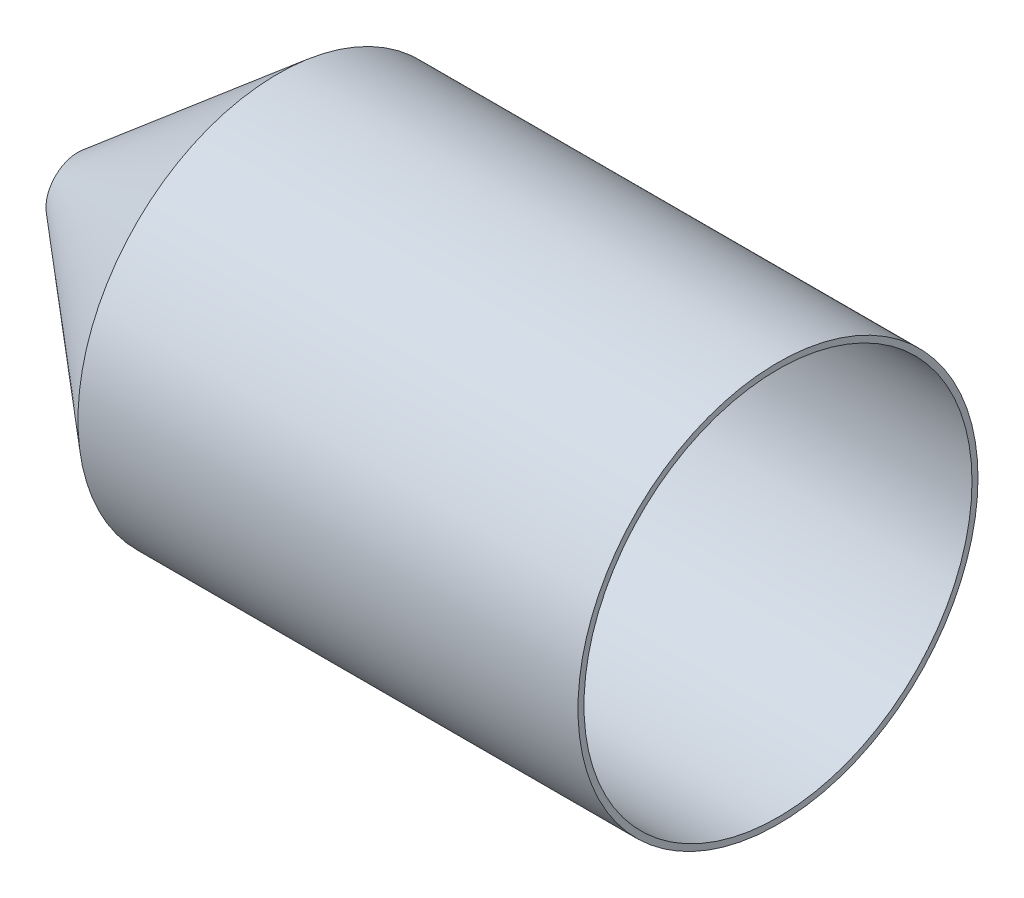
ISO-10303-21;
HEADER;
FILE_DESCRIPTION(('STEP AP214'),'2;1');
FILE_NAME('part.step','',(''),(''),'','','');
FILE_SCHEMA(('AUTOMOTIVE_DESIGN { 1 0 10303 214 1 1 1 1 }'));
ENDSEC;
DATA;
#1=APPLICATION_CONTEXT('core data for automotive mechanical design processes');
#2=APPLICATION_PROTOCOL_DEFINITION('international standard','automotive_design',2000,#1);
#3=PRODUCT_CONTEXT('',#1,'mechanical');
#4=PRODUCT('Part','Part','',(#3));
#5=PRODUCT_RELATED_PRODUCT_CATEGORY('part','',(#4));
#6=PRODUCT_DEFINITION_FORMATION('','',#4);
#7=PRODUCT_DEFINITION_CONTEXT('part definition',#1,'design');
#8=PRODUCT_DEFINITION('design','',#6,#7);
#9=PRODUCT_DEFINITION_SHAPE('','',#8);
#10=(LENGTH_UNIT() NAMED_UNIT(*) SI_UNIT(.MILLI.,.METRE.));
#11=(NAMED_UNIT(*) PLANE_ANGLE_UNIT() SI_UNIT($,.RADIAN.));
#12=(NAMED_UNIT(*) SI_UNIT($,.STERADIAN.) SOLID_ANGLE_UNIT());
#13=UNCERTAINTY_MEASURE_WITH_UNIT(LENGTH_MEASURE(1.E-05),#10,'distance_accuracy_value','');
#14=(GEOMETRIC_REPRESENTATION_CONTEXT(3) GLOBAL_UNCERTAINTY_ASSIGNED_CONTEXT((#13)) GLOBAL_UNIT_ASSIGNED_CONTEXT((#10,
#11,#12)) REPRESENTATION_CONTEXT('',''));
#15=CARTESIAN_POINT('',(0.,0.,0.));
#16=DIRECTION('',(0.,0.,1.));
#17=DIRECTION('',(1.,0.,0.));
#18=AXIS2_PLACEMENT_3D('',#15,#16,#17);
#19=CARTESIAN_POINT('',(-100.,0.,0.));
#20=DIRECTION('',(1.,0.,0.));
#21=DIRECTION('',(0.,0.,-1.));
#22=AXIS2_PLACEMENT_3D('',#19,#20,#21);
#23=CONICAL_SURFACE('',#22,16.,0.698659824721463);
#24=CARTESIAN_POINT('',(0.,0.,0.));
#25=DIRECTION('',(-1.,0.,0.));
#26=DIRECTION('',(0.,0.,1.));
#27=AXIS2_PLACEMENT_3D('',#24,#25,#26);
#28=CIRCLE('',#27,100.);
#29=CARTESIAN_POINT('',(0.,0.,-100.));
#30=VERTEX_POINT('',#29);
#31=EDGE_CURVE('E44',#30,#30,#28,.T.);
#32=CARTESIAN_POINT('',(-100.,0.,0.));
#33=DIRECTION('',(1.,0.,0.));
#34=DIRECTION('',(0.,0.,-1.));
#35=AXIS2_PLACEMENT_3D('',#32,#33,#34);
#36=CIRCLE('',#35,16.);
#37=CARTESIAN_POINT('',(-100.,0.,-16.));
#38=VERTEX_POINT('',#37);
#39=EDGE_CURVE('E11',#38,#38,#36,.T.);
#40=CARTESIAN_POINT('',(0.,0.,-100.));
#41=CARTESIAN_POINT('',(-1.04166666666667,0.,-99.125));
#42=CARTESIAN_POINT('',(-2.08333333333334,0.,-98.25));
#43=CARTESIAN_POINT('',(-4.16666666666667,0.,-96.5));
#44=CARTESIAN_POINT('',(-5.20833333333334,0.,-95.625));
#45=CARTESIAN_POINT('',(-7.29166666666667,0.,-93.875));
#46=CARTESIAN_POINT('',(-8.33333333333333,0.,-93.));
#47=CARTESIAN_POINT('',(-10.4166666666667,0.,-91.25));
#48=CARTESIAN_POINT('',(-11.4583333333333,0.,-90.375));
#49=CARTESIAN_POINT('',(-13.5416666666667,0.,-88.625));
#50=CARTESIAN_POINT('',(-14.5833333333333,0.,-87.75));
#51=CARTESIAN_POINT('',(-16.6666666666667,0.,-86.));
#52=CARTESIAN_POINT('',(-17.7083333333333,0.,-85.125));
#53=CARTESIAN_POINT('',(-19.7916666666667,0.,-83.375));
#54=CARTESIAN_POINT('',(-20.8333333333333,0.,-82.5));
#55=CARTESIAN_POINT('',(-22.9166666666667,0.,-80.75));
#56=CARTESIAN_POINT('',(-23.9583333333333,0.,-79.875));
#57=CARTESIAN_POINT('',(-26.0416666666667,0.,-78.125));
#58=CARTESIAN_POINT('',(-27.0833333333333,0.,-77.25));
#59=CARTESIAN_POINT('',(-29.1666666666667,0.,-75.5));
#60=CARTESIAN_POINT('',(-30.2083333333333,0.,-74.625));
#61=CARTESIAN_POINT('',(-32.2916666666667,0.,-72.875));
#62=CARTESIAN_POINT('',(-33.3333333333333,0.,-72.));
#63=CARTESIAN_POINT('',(-35.4166666666667,0.,-70.25));
#64=CARTESIAN_POINT('',(-36.4583333333333,0.,-69.375));
#65=CARTESIAN_POINT('',(-38.5416666666667,0.,-67.625));
#66=CARTESIAN_POINT('',(-39.5833333333333,0.,-66.75));
#67=CARTESIAN_POINT('',(-41.6666666666667,0.,-65.));
#68=CARTESIAN_POINT('',(-42.7083333333333,0.,-64.125));
#69=CARTESIAN_POINT('',(-44.7916666666667,0.,-62.375));
#70=CARTESIAN_POINT('',(-45.8333333333333,0.,-61.5));
#71=CARTESIAN_POINT('',(-47.9166666666667,0.,-59.75));
#72=CARTESIAN_POINT('',(-48.9583333333333,0.,-58.875));
#73=CARTESIAN_POINT('',(-51.0416666666667,0.,-57.125));
#74=CARTESIAN_POINT('',(-52.0833333333333,0.,-56.25));
#75=CARTESIAN_POINT('',(-54.1666666666667,0.,-54.5));
#76=CARTESIAN_POINT('',(-55.2083333333333,0.,-53.625));
#77=CARTESIAN_POINT('',(-57.2916666666667,0.,-51.875));
#78=CARTESIAN_POINT('',(-58.3333333333333,0.,-51.));
#79=CARTESIAN_POINT('',(-60.4166666666667,0.,-49.25));
#80=CARTESIAN_POINT('',(-61.4583333333333,0.,-48.375));
#81=CARTESIAN_POINT('',(-63.5416666666667,0.,-46.625));
#82=CARTESIAN_POINT('',(-64.5833333333333,0.,-45.75));
#83=CARTESIAN_POINT('',(-66.6666666666667,0.,-44.));
#84=CARTESIAN_POINT('',(-67.7083333333333,0.,-43.125));
#85=CARTESIAN_POINT('',(-69.7916666666667,0.,-41.375));
#86=CARTESIAN_POINT('',(-70.8333333333333,0.,-40.5));
#87=CARTESIAN_POINT('',(-72.9166666666667,0.,-38.75));
#88=CARTESIAN_POINT('',(-73.9583333333333,0.,-37.875));
#89=CARTESIAN_POINT('',(-76.0416666666667,0.,-36.125));
#90=CARTESIAN_POINT('',(-77.0833333333333,0.,-35.25));
#91=CARTESIAN_POINT('',(-79.1666666666667,0.,-33.5));
#92=CARTESIAN_POINT('',(-80.2083333333333,0.,-32.625));
#93=CARTESIAN_POINT('',(-82.2916666666667,0.,-30.875));
#94=CARTESIAN_POINT('',(-83.3333333333333,0.,-30.));
#95=CARTESIAN_POINT('',(-85.4166666666667,0.,-28.25));
#96=CARTESIAN_POINT('',(-86.4583333333333,0.,-27.375));
#97=CARTESIAN_POINT('',(-88.5416666666667,0.,-25.625));
#98=CARTESIAN_POINT('',(-89.5833333333333,0.,-24.75));
#99=CARTESIAN_POINT('',(-91.6666666666667,0.,-23.));
#100=CARTESIAN_POINT('',(-92.7083333333333,0.,-22.125));
#101=CARTESIAN_POINT('',(-94.7916666666667,0.,-20.375));
#102=CARTESIAN_POINT('',(-95.8333333333333,0.,-19.5));
#103=CARTESIAN_POINT('',(-97.9166666666667,0.,-17.75));
#104=CARTESIAN_POINT('',(-98.9583333333333,0.,-16.875));
#105=CARTESIAN_POINT('',(-100.,0.,-16.));
#106=B_SPLINE_CURVE_WITH_KNOTS('',3,(#40,#41,#42,#43,#44,#45,#46,#47,#48,#49,#50,#51,#52,#53,
#54,#55,#56,#57,#58,#59,#60,#61,#62,#63,#64,#65,#66,#67,#68,#69,#70,#71,#72,#73,#74,#75,#76,#77,
#78,#79,#80,#81,#82,#83,#84,#85,#86,#87,#88,#89,#90,#91,#92,#93,#94,#95,#96,#97,#98,#99,#100,
#101,#102,#103,#104,#105),.UNSPECIFIED.,.F.,.F.,(4,2,2,2,2,2,2,2,2,2,2,2,2,2,2,2,2,2,2,2,2,2,2,
2,2,2,2,2,2,2,2,2,4),(0.,4.08120692932863,8.16241385865726,12.2436207879859,16.3248277173145,
20.4060346466431,24.4872415759718,28.5684485053004,32.649655434629,36.7308623639576,
40.8120692932863,44.8932762226149,48.9744831519435,53.0556900812722,57.1368970106008,
61.2181039399294,65.299310869258,69.3805177985867,73.4617247279153,77.5429316572439,
81.6241385865725,85.7053455159012,89.7865524452298,93.8677593745584,97.9489663038871,
102.030173233216,106.111380162544,110.192587091873,114.273794021202,118.35500095053,
122.436207879859,126.517414809187,130.598621738516),.UNSPECIFIED.);
#107=EDGE_CURVE('BSEAM40',#30,#38,#106,.T.);
#108=ORIENTED_EDGE('',*,*,#31,.T.);
#109=ORIENTED_EDGE('',*,*,#39,.T.);
#110=ORIENTED_EDGE('',*,*,#107,.T.);
#111=ORIENTED_EDGE('',*,*,#107,.F.);
#112=EDGE_LOOP('',(#108,#110,#109,#111));
#113=FACE_BOUND('',#112,.T.);
#114=ADVANCED_FACE('F40',(#113),#23,.T.);
#115=OPEN_SHELL('',(#114));
#116=SHELL_BASED_SURFACE_MODEL('B2',(#115));
#117=CARTESIAN_POINT('',(250.,0.,0.));
#118=DIRECTION('',(1.,0.,0.));
#119=DIRECTION('',(0.,0.,-1.));
#120=AXIS2_PLACEMENT_3D('',#117,#118,#119);
#121=PLANE('',#120);
#122=CARTESIAN_POINT('',(250.,0.,0.));
#123=DIRECTION('',(1.,0.,0.));
#124=DIRECTION('',(0.,0.,-1.));
#125=AXIS2_PLACEMENT_3D('',#122,#123,#124);
#126=CIRCLE('',#125,100.);
#127=CARTESIAN_POINT('',(250.,0.,-100.));
#128=VERTEX_POINT('',#127);
#129=EDGE_CURVE('E39',#128,#128,#126,.T.);
#130=ORIENTED_EDGE('',*,*,#129,.T.);
#131=EDGE_LOOP('',(#130));
#132=FACE_BOUND('',#131,.T.);
#133=CARTESIAN_POINT('',(250.,0.,0.));
#134=DIRECTION('',(1.,0.,0.));
#135=DIRECTION('',(0.,0.,-1.));
#136=AXIS2_PLACEMENT_3D('',#133,#134,#135);
#137=CIRCLE('',#136,97.);
#138=CARTESIAN_POINT('',(250.,0.,-97.));
#139=VERTEX_POINT('',#138);
#140=EDGE_CURVE('E75',#139,#139,#137,.T.);
#141=ORIENTED_EDGE('',*,*,#140,.F.);
#142=EDGE_LOOP('',(#141));
#143=FACE_BOUND('',#142,.T.);
#144=ADVANCED_FACE('F64',(#132,#143),#121,.T.);
#145=CARTESIAN_POINT('',(0.,0.,0.));
#146=DIRECTION('',(1.,0.,0.));
#147=DIRECTION('',(0.,0.,-1.));
#148=AXIS2_PLACEMENT_3D('',#145,#146,#147);
#149=PLANE('',#148);
#150=CARTESIAN_POINT('',(0.,0.,0.));
#151=DIRECTION('',(1.,0.,0.));
#152=DIRECTION('',(0.,0.,-1.));
#153=AXIS2_PLACEMENT_3D('',#150,#151,#152);
#154=CIRCLE('',#153,100.);
#155=CARTESIAN_POINT('',(0.,0.,-100.));
#156=VERTEX_POINT('',#155);
#157=EDGE_CURVE('E68',#156,#156,#154,.T.);
#158=ORIENTED_EDGE('',*,*,#157,.F.);
#159=EDGE_LOOP('',(#158));
#160=FACE_BOUND('',#159,.T.);
#161=CARTESIAN_POINT('',(0.,0.,0.));
#162=DIRECTION('',(1.,0.,0.));
#163=DIRECTION('',(0.,0.,-1.));
#164=AXIS2_PLACEMENT_3D('',#161,#162,#163);
#165=CIRCLE('',#164,97.);
#166=CARTESIAN_POINT('',(0.,0.,-97.));
#167=VERTEX_POINT('',#166);
#168=EDGE_CURVE('E77',#167,#167,#165,.T.);
#169=ORIENTED_EDGE('',*,*,#168,.T.);
#170=EDGE_LOOP('',(#169));
#171=FACE_BOUND('',#170,.T.);
#172=ADVANCED_FACE('F87',(#160,#171),#149,.F.);
#173=CARTESIAN_POINT('',(250.,0.,0.));
#174=DIRECTION('',(-1.,0.,0.));
#175=DIRECTION('',(0.,0.,1.));
#176=AXIS2_PLACEMENT_3D('',#173,#174,#175);
#177=CYLINDRICAL_SURFACE('',#176,100.);
#178=ORIENTED_EDGE('',*,*,#129,.F.);
#179=EDGE_LOOP('',(#178));
#180=FACE_BOUND('',#179,.T.);
#181=ORIENTED_EDGE('',*,*,#157,.T.);
#182=EDGE_LOOP('',(#181));
#183=FACE_BOUND('',#182,.T.);
#184=ADVANCED_FACE('F66',(#180,#183),#177,.T.);
#185=CARTESIAN_POINT('',(250.,0.,0.));
#186=DIRECTION('',(-1.,0.,0.));
#187=DIRECTION('',(0.,0.,1.));
#188=AXIS2_PLACEMENT_3D('',#185,#186,#187);
#189=CYLINDRICAL_SURFACE('',#188,97.);
#190=ORIENTED_EDGE('',*,*,#140,.T.);
#191=EDGE_LOOP('',(#190));
#192=FACE_BOUND('',#191,.T.);
#193=ORIENTED_EDGE('',*,*,#168,.F.);
#194=EDGE_LOOP('',(#193));
#195=FACE_BOUND('',#194,.T.);
#196=ADVANCED_FACE('F83',(#192,#195),#189,.F.);
#197=CLOSED_SHELL('',(#144,#172,#184,#196));
#198=MANIFOLD_SOLID_BREP('B6',#197);
#199=ADVANCED_BREP_SHAPE_REPRESENTATION('',(#18,#198),#14);
#200=MANIFOLD_SURFACE_SHAPE_REPRESENTATION('',(#18,#116),#14);
#201=SHAPE_REPRESENTATION('',(#18),#14);
#202=SHAPE_DEFINITION_REPRESENTATION(#9,#201);
#203=SHAPE_REPRESENTATION_RELATIONSHIP('','',#201,#199);
#204=SHAPE_REPRESENTATION_RELATIONSHIP('','',#201,#200);
ENDSEC;
END-ISO-10303-21;
